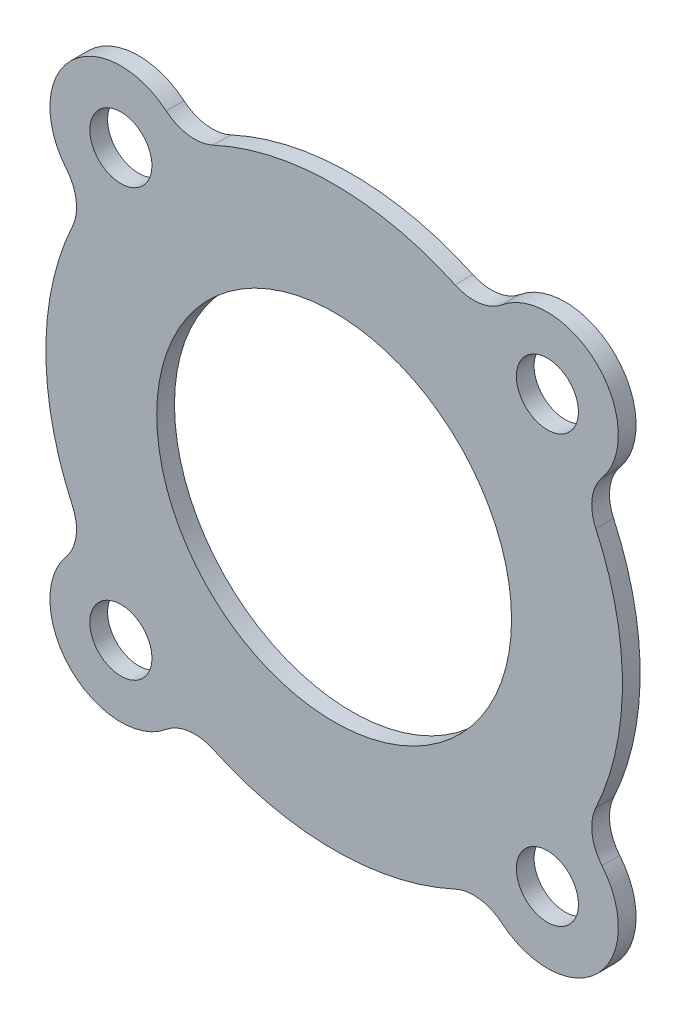
ISO-10303-21;
HEADER;
FILE_DESCRIPTION(('STEP AP214'),'2;1');
FILE_NAME('part.step','',(''),(''),'','','');
FILE_SCHEMA(('AUTOMOTIVE_DESIGN { 1 0 10303 214 1 1 1 1 }'));
ENDSEC;
DATA;
#1=APPLICATION_CONTEXT('core data for automotive mechanical design processes');
#2=APPLICATION_PROTOCOL_DEFINITION('international standard','automotive_design',2000,#1);
#3=PRODUCT_CONTEXT('',#1,'mechanical');
#4=PRODUCT('Part','Part','',(#3));
#5=PRODUCT_RELATED_PRODUCT_CATEGORY('part','',(#4));
#6=PRODUCT_DEFINITION_FORMATION('','',#4);
#7=PRODUCT_DEFINITION_CONTEXT('part definition',#1,'design');
#8=PRODUCT_DEFINITION('design','',#6,#7);
#9=PRODUCT_DEFINITION_SHAPE('','',#8);
#10=(LENGTH_UNIT() NAMED_UNIT(*) SI_UNIT(.MILLI.,.METRE.));
#11=(NAMED_UNIT(*) PLANE_ANGLE_UNIT() SI_UNIT($,.RADIAN.));
#12=(NAMED_UNIT(*) SI_UNIT($,.STERADIAN.) SOLID_ANGLE_UNIT());
#13=UNCERTAINTY_MEASURE_WITH_UNIT(LENGTH_MEASURE(1.E-05),#10,'distance_accuracy_value','');
#14=(GEOMETRIC_REPRESENTATION_CONTEXT(3) GLOBAL_UNCERTAINTY_ASSIGNED_CONTEXT((#13)) GLOBAL_UNIT_ASSIGNED_CONTEXT((#10,
#11,#12)) REPRESENTATION_CONTEXT('',''));
#15=CARTESIAN_POINT('',(0.,0.,0.));
#16=DIRECTION('',(0.,0.,1.));
#17=DIRECTION('',(1.,0.,0.));
#18=AXIS2_PLACEMENT_3D('',#15,#16,#17);
#19=CARTESIAN_POINT('',(0.,0.,2.));
#20=DIRECTION('',(0.,0.,-1.));
#21=DIRECTION('',(-1.,0.,0.));
#22=AXIS2_PLACEMENT_3D('',#19,#20,#21);
#23=CYLINDRICAL_SURFACE('',#22,32.5);
#24=CARTESIAN_POINT('',(0.,0.,0.));
#25=DIRECTION('',(0.,0.,1.));
#26=DIRECTION('',(1.,0.,0.));
#27=AXIS2_PLACEMENT_3D('',#24,#25,#26);
#28=CIRCLE('',#27,32.5);
#29=CARTESIAN_POINT('',(13.6353021774067,29.5013310637132,0.));
#30=VERTEX_POINT('',#29);
#31=CARTESIAN_POINT('',(-13.6353021774065,29.5013310637132,0.));
#32=VERTEX_POINT('',#31);
#33=EDGE_CURVE('E170',#30,#32,#28,.T.);
#34=ORIENTED_EDGE('',*,*,#33,.T.);
#35=DIRECTION('',(0.,0.,-1.));
#36=VECTOR('',#35,1.);
#37=CARTESIAN_POINT('',(-13.6353021774065,29.5013310637133,2.));
#38=LINE('',#37,#36);
#39=CARTESIAN_POINT('',(-13.6353021774065,29.5013310637132,2.));
#40=VERTEX_POINT('',#39);
#41=EDGE_CURVE('E292',#32,#40,#38,.F.);
#42=ORIENTED_EDGE('',*,*,#41,.T.);
#43=CARTESIAN_POINT('',(0.,0.,2.));
#44=DIRECTION('',(0.,0.,1.));
#45=DIRECTION('',(1.,0.,0.));
#46=AXIS2_PLACEMENT_3D('',#43,#44,#45);
#47=CIRCLE('',#46,32.5);
#48=CARTESIAN_POINT('',(13.6353021774067,29.5013310637132,2.));
#49=VERTEX_POINT('',#48);
#50=EDGE_CURVE('E173',#49,#40,#47,.T.);
#51=ORIENTED_EDGE('',*,*,#50,.F.);
#52=DIRECTION('',(0.,0.,-1.));
#53=VECTOR('',#52,1.);
#54=CARTESIAN_POINT('',(13.6353021774067,29.5013310637132,2.));
#55=LINE('',#54,#53);
#56=EDGE_CURVE('E156',#49,#30,#55,.T.);
#57=ORIENTED_EDGE('',*,*,#56,.T.);
#58=EDGE_LOOP('',(#34,#42,#51,#57));
#59=FACE_BOUND('',#58,.T.);
#60=ADVANCED_FACE('F39',(#59),#23,.T.);
#61=CARTESIAN_POINT('',(-29.501331063713,13.635302177407,2.));
#62=VERTEX_POINT('',#61);
#63=CARTESIAN_POINT('',(-29.5013310637131,-13.6353021774068,2.));
#64=VERTEX_POINT('',#63);
#65=EDGE_CURVE('E215',#62,#64,#47,.T.);
#66=ORIENTED_EDGE('',*,*,#65,.F.);
#67=DIRECTION('',(0.,0.,-1.));
#68=VECTOR('',#67,1.);
#69=CARTESIAN_POINT('',(-29.501331063713,13.635302177407,2.));
#70=LINE('',#69,#68);
#71=CARTESIAN_POINT('',(-29.501331063713,13.635302177407,0.));
#72=VERTEX_POINT('',#71);
#73=EDGE_CURVE('E301',#62,#72,#70,.T.);
#74=ORIENTED_EDGE('',*,*,#73,.T.);
#75=CARTESIAN_POINT('',(-29.5013310637131,-13.6353021774068,0.));
#76=VERTEX_POINT('',#75);
#77=EDGE_CURVE('E185',#72,#76,#28,.T.);
#78=ORIENTED_EDGE('',*,*,#77,.T.);
#79=DIRECTION('',(0.,0.,-1.));
#80=VECTOR('',#79,1.);
#81=CARTESIAN_POINT('',(-29.5013310637131,-13.6353021774068,2.));
#82=LINE('',#81,#80);
#83=EDGE_CURVE('E267',#76,#64,#82,.F.);
#84=ORIENTED_EDGE('',*,*,#83,.T.);
#85=EDGE_LOOP('',(#66,#74,#78,#84));
#86=FACE_BOUND('',#85,.T.);
#87=ADVANCED_FACE('F320',(#86),#23,.T.);
#88=CARTESIAN_POINT('',(-13.6353021774067,-29.5013310637132,2.));
#89=VERTEX_POINT('',#88);
#90=CARTESIAN_POINT('',(13.6353021774067,-29.5013310637132,2.));
#91=VERTEX_POINT('',#90);
#92=EDGE_CURVE('E190',#89,#91,#47,.T.);
#93=ORIENTED_EDGE('',*,*,#92,.F.);
#94=DIRECTION('',(0.,0.,-1.));
#95=VECTOR('',#94,1.);
#96=CARTESIAN_POINT('',(-13.6353021774067,-29.5013310637132,2.));
#97=LINE('',#96,#95);
#98=CARTESIAN_POINT('',(-13.6353021774067,-29.5013310637132,0.));
#99=VERTEX_POINT('',#98);
#100=EDGE_CURVE('E277',#89,#99,#97,.T.);
#101=ORIENTED_EDGE('',*,*,#100,.T.);
#102=CARTESIAN_POINT('',(13.6353021774067,-29.5013310637132,0.));
#103=VERTEX_POINT('',#102);
#104=EDGE_CURVE('E192',#99,#103,#28,.T.);
#105=ORIENTED_EDGE('',*,*,#104,.T.);
#106=DIRECTION('',(0.,0.,-1.));
#107=VECTOR('',#106,1.);
#108=CARTESIAN_POINT('',(13.6353021774067,-29.5013310637132,2.));
#109=LINE('',#108,#107);
#110=EDGE_CURVE('E238',#103,#91,#109,.F.);
#111=ORIENTED_EDGE('',*,*,#110,.T.);
#112=EDGE_LOOP('',(#93,#101,#105,#111));
#113=FACE_BOUND('',#112,.T.);
#114=ADVANCED_FACE('F244',(#113),#23,.T.);
#115=CARTESIAN_POINT('',(0.,0.,2.));
#116=DIRECTION('',(0.,0.,1.));
#117=DIRECTION('',(1.,0.,0.));
#118=AXIS2_PLACEMENT_3D('',#115,#116,#117);
#119=PLANE('',#118);
#120=CARTESIAN_POINT('',(24.0416305603426,-24.0416305603427,2.));
#121=DIRECTION('',(0.,0.,1.));
#122=DIRECTION('',(0.,-1.,0.));
#123=AXIS2_PLACEMENT_3D('',#120,#121,#122);
#124=CIRCLE('',#123,3.5);
#125=CARTESIAN_POINT('',(24.0416305603426,-27.5416305603427,2.));
#126=VERTEX_POINT('',#125);
#127=EDGE_CURVE('E457',#126,#126,#124,.T.);
#128=ORIENTED_EDGE('',*,*,#127,.F.);
#129=EDGE_LOOP('',(#128));
#130=FACE_BOUND('',#129,.T.);
#131=CARTESIAN_POINT('',(-24.0416305603426,-24.0416305603427,2.));
#132=DIRECTION('',(0.,0.,1.));
#133=DIRECTION('',(-1.,0.,0.));
#134=AXIS2_PLACEMENT_3D('',#131,#132,#133);
#135=CIRCLE('',#134,3.5);
#136=CARTESIAN_POINT('',(-27.5416305603426,-24.0416305603427,2.));
#137=VERTEX_POINT('',#136);
#138=EDGE_CURVE('E468',#137,#137,#135,.T.);
#139=ORIENTED_EDGE('',*,*,#138,.F.);
#140=EDGE_LOOP('',(#139));
#141=FACE_BOUND('',#140,.T.);
#142=CARTESIAN_POINT('',(-24.0416305603424,24.0416305603428,2.));
#143=DIRECTION('',(0.,0.,1.));
#144=DIRECTION('',(0.,1.,0.));
#145=AXIS2_PLACEMENT_3D('',#142,#143,#144);
#146=CIRCLE('',#145,3.5);
#147=CARTESIAN_POINT('',(-24.0416305603424,27.5416305603428,2.));
#148=VERTEX_POINT('',#147);
#149=EDGE_CURVE('E460',#148,#148,#146,.T.);
#150=ORIENTED_EDGE('',*,*,#149,.F.);
#151=EDGE_LOOP('',(#150));
#152=FACE_BOUND('',#151,.T.);
#153=ORIENTED_EDGE('',*,*,#50,.T.);
#154=CARTESIAN_POINT('',(-15.7330409739306,34.0399973812076,2.));
#155=DIRECTION('',(0.,0.,1.));
#156=DIRECTION('',(1.,0.,0.));
#157=AXIS2_PLACEMENT_3D('',#154,#155,#156);
#158=CIRCLE('',#157,5.);
#159=CARTESIAN_POINT('',(-18.9286523533198,30.194471680875,2.));
#160=VERTEX_POINT('',#159);
#161=EDGE_CURVE('E304',#40,#160,#158,.F.);
#162=ORIENTED_EDGE('',*,*,#161,.T.);
#163=CARTESIAN_POINT('',(-24.0416305603424,24.0416305603428,2.));
#164=DIRECTION('',(0.,0.,1.));
#165=DIRECTION('',(0.,1.,0.));
#166=AXIS2_PLACEMENT_3D('',#163,#164,#165);
#167=CIRCLE('',#166,7.99999999999999);
#168=CARTESIAN_POINT('',(-30.1944716808747,18.9286523533203,2.));
#169=VERTEX_POINT('',#168);
#170=EDGE_CURVE('E317',#160,#169,#167,.T.);
#171=ORIENTED_EDGE('',*,*,#170,.T.);
#172=CARTESIAN_POINT('',(-34.0399973812073,15.7330409739312,2.));
#173=DIRECTION('',(0.,0.,1.));
#174=DIRECTION('',(1.,0.,0.));
#175=AXIS2_PLACEMENT_3D('',#172,#173,#174);
#176=CIRCLE('',#175,5.);
#177=EDGE_CURVE('E11',#169,#62,#176,.F.);
#178=ORIENTED_EDGE('',*,*,#177,.T.);
#179=ORIENTED_EDGE('',*,*,#65,.T.);
#180=CARTESIAN_POINT('',(-34.0399973812074,-15.733040973931,2.));
#181=DIRECTION('',(0.,0.,1.));
#182=DIRECTION('',(1.,0.,0.));
#183=AXIS2_PLACEMENT_3D('',#180,#181,#182);
#184=CIRCLE('',#183,5.);
#185=CARTESIAN_POINT('',(-30.1944716808748,-18.9286523533201,2.));
#186=VERTEX_POINT('',#185);
#187=EDGE_CURVE('E280',#64,#186,#184,.F.);
#188=ORIENTED_EDGE('',*,*,#187,.T.);
#189=CARTESIAN_POINT('',(-24.0416305603426,-24.0416305603427,2.));
#190=DIRECTION('',(0.,0.,1.));
#191=DIRECTION('',(-1.,0.,0.));
#192=AXIS2_PLACEMENT_3D('',#189,#190,#191);
#193=CIRCLE('',#192,7.99999999999999);
#194=CARTESIAN_POINT('',(-18.92865235332,-30.1944716808749,2.));
#195=VERTEX_POINT('',#194);
#196=EDGE_CURVE('E316',#186,#195,#193,.T.);
#197=ORIENTED_EDGE('',*,*,#196,.T.);
#198=CARTESIAN_POINT('',(-15.7330409739308,-34.0399973812075,2.));
#199=DIRECTION('',(0.,0.,1.));
#200=DIRECTION('',(1.,0.,0.));
#201=AXIS2_PLACEMENT_3D('',#198,#199,#200);
#202=CIRCLE('',#201,5.);
#203=EDGE_CURVE('E228',#195,#89,#202,.F.);
#204=ORIENTED_EDGE('',*,*,#203,.T.);
#205=ORIENTED_EDGE('',*,*,#92,.T.);
#206=CARTESIAN_POINT('',(15.7330409739309,-34.0399973812075,2.));
#207=DIRECTION('',(0.,0.,1.));
#208=DIRECTION('',(1.,0.,0.));
#209=AXIS2_PLACEMENT_3D('',#206,#207,#208);
#210=CIRCLE('',#209,5.);
#211=CARTESIAN_POINT('',(18.92865235332,-30.1944716808749,2.));
#212=VERTEX_POINT('',#211);
#213=EDGE_CURVE('E224',#91,#212,#210,.F.);
#214=ORIENTED_EDGE('',*,*,#213,.T.);
#215=CARTESIAN_POINT('',(24.0416305603426,-24.0416305603427,2.));
#216=DIRECTION('',(0.,0.,1.));
#217=DIRECTION('',(0.,-1.,0.));
#218=AXIS2_PLACEMENT_3D('',#215,#216,#217);
#219=CIRCLE('',#218,7.99999999999999);
#220=CARTESIAN_POINT('',(30.1944716808748,-18.9286523533201,2.));
#221=VERTEX_POINT('',#220);
#222=EDGE_CURVE('E336',#212,#221,#219,.T.);
#223=ORIENTED_EDGE('',*,*,#222,.T.);
#224=CARTESIAN_POINT('',(34.0399973812074,-15.733040973931,2.));
#225=DIRECTION('',(0.,0.,1.));
#226=DIRECTION('',(1.,0.,0.));
#227=AXIS2_PLACEMENT_3D('',#224,#225,#226);
#228=CIRCLE('',#227,5.);
#229=CARTESIAN_POINT('',(29.5013310637131,-13.6353021774068,2.));
#230=VERTEX_POINT('',#229);
#231=EDGE_CURVE('E264',#221,#230,#228,.F.);
#232=ORIENTED_EDGE('',*,*,#231,.T.);
#233=CARTESIAN_POINT('',(29.5013310637131,13.6353021774068,2.));
#234=VERTEX_POINT('',#233);
#235=EDGE_CURVE('E184',#230,#234,#47,.T.);
#236=ORIENTED_EDGE('',*,*,#235,.T.);
#237=CARTESIAN_POINT('',(34.0399973812074,15.733040973931,2.));
#238=DIRECTION('',(0.,0.,1.));
#239=DIRECTION('',(1.,0.,0.));
#240=AXIS2_PLACEMENT_3D('',#237,#238,#239);
#241=CIRCLE('',#240,5.);
#242=CARTESIAN_POINT('',(30.1944716808748,18.9286523533201,2.));
#243=VERTEX_POINT('',#242);
#244=EDGE_CURVE('E359',#234,#243,#241,.F.);
#245=ORIENTED_EDGE('',*,*,#244,.T.);
#246=CARTESIAN_POINT('',(24.0416305603426,24.0416305603427,2.));
#247=DIRECTION('',(0.,0.,1.));
#248=DIRECTION('',(1.,0.,0.));
#249=AXIS2_PLACEMENT_3D('',#246,#247,#248);
#250=CIRCLE('',#249,7.99999999999999);
#251=CARTESIAN_POINT('',(18.92865235332,30.1944716808749,2.));
#252=VERTEX_POINT('',#251);
#253=EDGE_CURVE('E212',#243,#252,#250,.T.);
#254=ORIENTED_EDGE('',*,*,#253,.T.);
#255=CARTESIAN_POINT('',(15.7330409739308,34.0399973812075,2.));
#256=DIRECTION('',(0.,0.,1.));
#257=DIRECTION('',(1.,0.,0.));
#258=AXIS2_PLACEMENT_3D('',#255,#256,#257);
#259=CIRCLE('',#258,5.);
#260=EDGE_CURVE('E163',#252,#49,#259,.F.);
#261=ORIENTED_EDGE('',*,*,#260,.T.);
#262=EDGE_LOOP('',(#153,#162,#171,#178,#179,#188,#197,#204,#205,#214,#223,#232,#236,#245,#254,#261));
#263=FACE_BOUND('',#262,.T.);
#264=CARTESIAN_POINT('',(24.0416305603426,24.0416305603427,2.));
#265=DIRECTION('',(0.,0.,1.));
#266=DIRECTION('',(1.,0.,0.));
#267=AXIS2_PLACEMENT_3D('',#264,#265,#266);
#268=CIRCLE('',#267,3.5);
#269=CARTESIAN_POINT('',(27.5416305603426,24.0416305603427,2.));
#270=VERTEX_POINT('',#269);
#271=EDGE_CURVE('E344',#270,#270,#268,.T.);
#272=ORIENTED_EDGE('',*,*,#271,.F.);
#273=EDGE_LOOP('',(#272));
#274=FACE_BOUND('',#273,.T.);
#275=CARTESIAN_POINT('',(0.,0.,2.));
#276=DIRECTION('',(0.,0.,1.));
#277=DIRECTION('',(1.,0.,0.));
#278=AXIS2_PLACEMENT_3D('',#275,#276,#277);
#279=CIRCLE('',#278,20.);
#280=CARTESIAN_POINT('',(20.,0.,2.));
#281=VERTEX_POINT('',#280);
#282=EDGE_CURVE('E194',#281,#281,#279,.T.);
#283=ORIENTED_EDGE('',*,*,#282,.F.);
#284=EDGE_LOOP('',(#283));
#285=FACE_BOUND('',#284,.T.);
#286=ADVANCED_FACE('F221',(#130,#141,#152,#263,#274,#285),#119,.T.);
#287=CARTESIAN_POINT('',(0.,0.,0.));
#288=DIRECTION('',(0.,0.,1.));
#289=DIRECTION('',(1.,0.,0.));
#290=AXIS2_PLACEMENT_3D('',#287,#288,#289);
#291=PLANE('',#290);
#292=CARTESIAN_POINT('',(24.0416305603426,-24.0416305603427,0.));
#293=DIRECTION('',(0.,0.,1.));
#294=DIRECTION('',(0.,-1.,0.));
#295=AXIS2_PLACEMENT_3D('',#292,#293,#294);
#296=CIRCLE('',#295,3.5);
#297=CARTESIAN_POINT('',(24.0416305603426,-27.5416305603427,0.));
#298=VERTEX_POINT('',#297);
#299=EDGE_CURVE('E454',#298,#298,#296,.T.);
#300=ORIENTED_EDGE('',*,*,#299,.T.);
#301=EDGE_LOOP('',(#300));
#302=FACE_BOUND('',#301,.T.);
#303=CARTESIAN_POINT('',(-24.0416305603426,-24.0416305603427,0.));
#304=DIRECTION('',(0.,0.,1.));
#305=DIRECTION('',(-1.,0.,0.));
#306=AXIS2_PLACEMENT_3D('',#303,#304,#305);
#307=CIRCLE('',#306,3.5);
#308=CARTESIAN_POINT('',(-27.5416305603426,-24.0416305603427,0.));
#309=VERTEX_POINT('',#308);
#310=EDGE_CURVE('E472',#309,#309,#307,.T.);
#311=ORIENTED_EDGE('',*,*,#310,.T.);
#312=EDGE_LOOP('',(#311));
#313=FACE_BOUND('',#312,.T.);
#314=CARTESIAN_POINT('',(-24.0416305603424,24.0416305603428,0.));
#315=DIRECTION('',(0.,0.,1.));
#316=DIRECTION('',(0.,1.,0.));
#317=AXIS2_PLACEMENT_3D('',#314,#315,#316);
#318=CIRCLE('',#317,3.5);
#319=CARTESIAN_POINT('',(-24.0416305603424,27.5416305603428,0.));
#320=VERTEX_POINT('',#319);
#321=EDGE_CURVE('E464',#320,#320,#318,.T.);
#322=ORIENTED_EDGE('',*,*,#321,.T.);
#323=EDGE_LOOP('',(#322));
#324=FACE_BOUND('',#323,.T.);
#325=CARTESIAN_POINT('',(24.0416305603426,24.0416305603427,0.));
#326=DIRECTION('',(0.,0.,1.));
#327=DIRECTION('',(1.,0.,0.));
#328=AXIS2_PLACEMENT_3D('',#325,#326,#327);
#329=CIRCLE('',#328,3.5);
#330=CARTESIAN_POINT('',(27.5416305603426,24.0416305603427,0.));
#331=VERTEX_POINT('',#330);
#332=EDGE_CURVE('E347',#331,#331,#329,.T.);
#333=ORIENTED_EDGE('',*,*,#332,.T.);
#334=EDGE_LOOP('',(#333));
#335=FACE_BOUND('',#334,.T.);
#336=ORIENTED_EDGE('',*,*,#77,.F.);
#337=CARTESIAN_POINT('',(-34.0399973812073,15.7330409739312,0.));
#338=DIRECTION('',(0.,0.,1.));
#339=DIRECTION('',(1.,0.,0.));
#340=AXIS2_PLACEMENT_3D('',#337,#338,#339);
#341=CIRCLE('',#340,5.);
#342=CARTESIAN_POINT('',(-30.1944716808747,18.9286523533203,0.));
#343=VERTEX_POINT('',#342);
#344=EDGE_CURVE('E48',#72,#343,#341,.T.);
#345=ORIENTED_EDGE('',*,*,#344,.T.);
#346=CARTESIAN_POINT('',(-24.0416305603424,24.0416305603428,0.));
#347=DIRECTION('',(0.,0.,1.));
#348=DIRECTION('',(0.,1.,0.));
#349=AXIS2_PLACEMENT_3D('',#346,#347,#348);
#350=CIRCLE('',#349,7.99999999999999);
#351=CARTESIAN_POINT('',(-18.9286523533198,30.194471680875,0.));
#352=VERTEX_POINT('',#351);
#353=EDGE_CURVE('E310',#352,#343,#350,.T.);
#354=ORIENTED_EDGE('',*,*,#353,.F.);
#355=CARTESIAN_POINT('',(-15.7330409739306,34.0399973812076,0.));
#356=DIRECTION('',(0.,0.,1.));
#357=DIRECTION('',(1.,0.,0.));
#358=AXIS2_PLACEMENT_3D('',#355,#356,#357);
#359=CIRCLE('',#358,5.);
#360=EDGE_CURVE('E182',#352,#32,#359,.T.);
#361=ORIENTED_EDGE('',*,*,#360,.T.);
#362=ORIENTED_EDGE('',*,*,#33,.F.);
#363=CARTESIAN_POINT('',(15.7330409739308,34.0399973812075,0.));
#364=DIRECTION('',(0.,0.,1.));
#365=DIRECTION('',(1.,0.,0.));
#366=AXIS2_PLACEMENT_3D('',#363,#364,#365);
#367=CIRCLE('',#366,5.);
#368=CARTESIAN_POINT('',(18.92865235332,30.1944716808749,0.));
#369=VERTEX_POINT('',#368);
#370=EDGE_CURVE('E152',#30,#369,#367,.T.);
#371=ORIENTED_EDGE('',*,*,#370,.T.);
#372=CARTESIAN_POINT('',(24.0416305603426,24.0416305603427,0.));
#373=DIRECTION('',(0.,0.,1.));
#374=DIRECTION('',(1.,0.,0.));
#375=AXIS2_PLACEMENT_3D('',#372,#373,#374);
#376=CIRCLE('',#375,7.99999999999999);
#377=CARTESIAN_POINT('',(30.1944716808748,18.9286523533201,0.));
#378=VERTEX_POINT('',#377);
#379=EDGE_CURVE('E209',#378,#369,#376,.T.);
#380=ORIENTED_EDGE('',*,*,#379,.F.);
#381=CARTESIAN_POINT('',(34.0399973812074,15.733040973931,0.));
#382=DIRECTION('',(0.,0.,1.));
#383=DIRECTION('',(1.,0.,0.));
#384=AXIS2_PLACEMENT_3D('',#381,#382,#383);
#385=CIRCLE('',#384,5.);
#386=CARTESIAN_POINT('',(29.5013310637131,13.6353021774068,0.));
#387=VERTEX_POINT('',#386);
#388=EDGE_CURVE('E164',#378,#387,#385,.T.);
#389=ORIENTED_EDGE('',*,*,#388,.T.);
#390=CARTESIAN_POINT('',(29.5013310637131,-13.6353021774068,0.));
#391=VERTEX_POINT('',#390);
#392=EDGE_CURVE('E187',#391,#387,#28,.T.);
#393=ORIENTED_EDGE('',*,*,#392,.F.);
#394=CARTESIAN_POINT('',(34.0399973812074,-15.733040973931,0.));
#395=DIRECTION('',(0.,0.,1.));
#396=DIRECTION('',(1.,0.,0.));
#397=AXIS2_PLACEMENT_3D('',#394,#395,#396);
#398=CIRCLE('',#397,5.);
#399=CARTESIAN_POINT('',(30.1944716808748,-18.9286523533201,0.));
#400=VERTEX_POINT('',#399);
#401=EDGE_CURVE('E261',#391,#400,#398,.T.);
#402=ORIENTED_EDGE('',*,*,#401,.T.);
#403=CARTESIAN_POINT('',(24.0416305603426,-24.0416305603427,0.));
#404=DIRECTION('',(0.,0.,1.));
#405=DIRECTION('',(0.,-1.,0.));
#406=AXIS2_PLACEMENT_3D('',#403,#404,#405);
#407=CIRCLE('',#406,7.99999999999999);
#408=CARTESIAN_POINT('',(18.92865235332,-30.1944716808749,0.));
#409=VERTEX_POINT('',#408);
#410=EDGE_CURVE('E340',#409,#400,#407,.T.);
#411=ORIENTED_EDGE('',*,*,#410,.F.);
#412=CARTESIAN_POINT('',(15.7330409739309,-34.0399973812075,0.));
#413=DIRECTION('',(0.,0.,1.));
#414=DIRECTION('',(1.,0.,0.));
#415=AXIS2_PLACEMENT_3D('',#412,#413,#414);
#416=CIRCLE('',#415,5.);
#417=EDGE_CURVE('E241',#409,#103,#416,.T.);
#418=ORIENTED_EDGE('',*,*,#417,.T.);
#419=ORIENTED_EDGE('',*,*,#104,.F.);
#420=CARTESIAN_POINT('',(-15.7330409739308,-34.0399973812075,0.));
#421=DIRECTION('',(0.,0.,1.));
#422=DIRECTION('',(1.,0.,0.));
#423=AXIS2_PLACEMENT_3D('',#420,#421,#422);
#424=CIRCLE('',#423,5.);
#425=CARTESIAN_POINT('',(-18.92865235332,-30.1944716808749,0.));
#426=VERTEX_POINT('',#425);
#427=EDGE_CURVE('E287',#99,#426,#424,.T.);
#428=ORIENTED_EDGE('',*,*,#427,.T.);
#429=CARTESIAN_POINT('',(-24.0416305603426,-24.0416305603427,0.));
#430=DIRECTION('',(0.,0.,1.));
#431=DIRECTION('',(-1.,0.,0.));
#432=AXIS2_PLACEMENT_3D('',#429,#430,#431);
#433=CIRCLE('',#432,7.99999999999999);
#434=CARTESIAN_POINT('',(-30.1944716808748,-18.9286523533201,0.));
#435=VERTEX_POINT('',#434);
#436=EDGE_CURVE('E333',#435,#426,#433,.T.);
#437=ORIENTED_EDGE('',*,*,#436,.F.);
#438=CARTESIAN_POINT('',(-34.0399973812074,-15.733040973931,0.));
#439=DIRECTION('',(0.,0.,1.));
#440=DIRECTION('',(1.,0.,0.));
#441=AXIS2_PLACEMENT_3D('',#438,#439,#440);
#442=CIRCLE('',#441,5.);
#443=EDGE_CURVE('E283',#435,#76,#442,.T.);
#444=ORIENTED_EDGE('',*,*,#443,.T.);
#445=EDGE_LOOP('',(#336,#345,#354,#361,#362,#371,#380,#389,#393,#402,#411,#418,#419,#428,#437,#444));
#446=FACE_BOUND('',#445,.T.);
#447=CARTESIAN_POINT('',(0.,0.,0.));
#448=DIRECTION('',(0.,0.,1.));
#449=DIRECTION('',(1.,0.,0.));
#450=AXIS2_PLACEMENT_3D('',#447,#448,#449);
#451=CIRCLE('',#450,20.);
#452=CARTESIAN_POINT('',(20.,0.,0.));
#453=VERTEX_POINT('',#452);
#454=EDGE_CURVE('E203',#453,#453,#451,.T.);
#455=ORIENTED_EDGE('',*,*,#454,.T.);
#456=EDGE_LOOP('',(#455));
#457=FACE_BOUND('',#456,.T.);
#458=ADVANCED_FACE('F178',(#302,#313,#324,#335,#446,#457),#291,.F.);
#459=ORIENTED_EDGE('',*,*,#235,.F.);
#460=DIRECTION('',(0.,0.,-1.));
#461=VECTOR('',#460,1.);
#462=CARTESIAN_POINT('',(29.5013310637131,-13.6353021774068,2.));
#463=LINE('',#462,#461);
#464=EDGE_CURVE('E242',#230,#391,#463,.T.);
#465=ORIENTED_EDGE('',*,*,#464,.T.);
#466=ORIENTED_EDGE('',*,*,#392,.T.);
#467=DIRECTION('',(0.,0.,-1.));
#468=VECTOR('',#467,1.);
#469=CARTESIAN_POINT('',(29.5013310637131,13.6353021774068,2.));
#470=LINE('',#469,#468);
#471=EDGE_CURVE('E175',#387,#234,#470,.F.);
#472=ORIENTED_EDGE('',*,*,#471,.T.);
#473=EDGE_LOOP('',(#459,#465,#466,#472));
#474=FACE_BOUND('',#473,.T.);
#475=ADVANCED_FACE('F378',(#474),#23,.T.);
#476=CARTESIAN_POINT('',(0.,0.,2.));
#477=DIRECTION('',(0.,0.,-1.));
#478=DIRECTION('',(-1.,0.,0.));
#479=AXIS2_PLACEMENT_3D('',#476,#477,#478);
#480=CYLINDRICAL_SURFACE('',#479,20.);
#481=ORIENTED_EDGE('',*,*,#282,.T.);
#482=EDGE_LOOP('',(#481));
#483=FACE_BOUND('',#482,.T.);
#484=ORIENTED_EDGE('',*,*,#454,.F.);
#485=EDGE_LOOP('',(#484));
#486=FACE_BOUND('',#485,.T.);
#487=ADVANCED_FACE('F404',(#483,#486),#480,.F.);
#488=CARTESIAN_POINT('',(24.0416305603426,24.0416305603427,0.));
#489=DIRECTION('',(0.,0.,1.));
#490=DIRECTION('',(1.,0.,0.));
#491=AXIS2_PLACEMENT_3D('',#488,#489,#490);
#492=CYLINDRICAL_SURFACE('',#491,7.99999999999999);
#493=ORIENTED_EDGE('',*,*,#253,.F.);
#494=DIRECTION('',(0.,0.,1.));
#495=VECTOR('',#494,1.);
#496=CARTESIAN_POINT('',(30.1944716808748,18.9286523533201,0.));
#497=LINE('',#496,#495);
#498=EDGE_CURVE('E362',#243,#378,#497,.F.);
#499=ORIENTED_EDGE('',*,*,#498,.T.);
#500=ORIENTED_EDGE('',*,*,#379,.T.);
#501=DIRECTION('',(0.,0.,1.));
#502=VECTOR('',#501,1.);
#503=CARTESIAN_POINT('',(18.92865235332,30.1944716808749,0.));
#504=LINE('',#503,#502);
#505=EDGE_CURVE('E157',#369,#252,#504,.T.);
#506=ORIENTED_EDGE('',*,*,#505,.T.);
#507=EDGE_LOOP('',(#493,#499,#500,#506));
#508=FACE_BOUND('',#507,.T.);
#509=ADVANCED_FACE('F361',(#508),#492,.T.);
#510=CARTESIAN_POINT('',(24.0416305603426,24.0416305603427,0.));
#511=DIRECTION('',(0.,0.,1.));
#512=DIRECTION('',(1.,0.,0.));
#513=AXIS2_PLACEMENT_3D('',#510,#511,#512);
#514=CYLINDRICAL_SURFACE('',#513,3.5);
#515=ORIENTED_EDGE('',*,*,#332,.F.);
#516=EDGE_LOOP('',(#515));
#517=FACE_BOUND('',#516,.T.);
#518=ORIENTED_EDGE('',*,*,#271,.T.);
#519=EDGE_LOOP('',(#518));
#520=FACE_BOUND('',#519,.T.);
#521=ADVANCED_FACE('F423',(#517,#520),#514,.F.);
#522=CARTESIAN_POINT('',(34.0399973812074,15.733040973931,0.));
#523=DIRECTION('',(0.,0.,-1.));
#524=DIRECTION('',(-1.,0.,0.));
#525=AXIS2_PLACEMENT_3D('',#522,#523,#524);
#526=CYLINDRICAL_SURFACE('',#525,5.);
#527=ORIENTED_EDGE('',*,*,#388,.F.);
#528=ORIENTED_EDGE('',*,*,#498,.F.);
#529=ORIENTED_EDGE('',*,*,#244,.F.);
#530=ORIENTED_EDGE('',*,*,#471,.F.);
#531=EDGE_LOOP('',(#527,#528,#529,#530));
#532=FACE_BOUND('',#531,.T.);
#533=ADVANCED_FACE('F365',(#532),#526,.F.);
#534=CARTESIAN_POINT('',(15.7330409739308,34.0399973812075,0.));
#535=DIRECTION('',(0.,0.,1.));
#536=DIRECTION('',(1.,0.,0.));
#537=AXIS2_PLACEMENT_3D('',#534,#535,#536);
#538=CYLINDRICAL_SURFACE('',#537,5.);
#539=ORIENTED_EDGE('',*,*,#260,.F.);
#540=ORIENTED_EDGE('',*,*,#505,.F.);
#541=ORIENTED_EDGE('',*,*,#370,.F.);
#542=ORIENTED_EDGE('',*,*,#56,.F.);
#543=EDGE_LOOP('',(#539,#540,#541,#542));
#544=FACE_BOUND('',#543,.T.);
#545=ADVANCED_FACE('F155',(#544),#538,.F.);
#546=CARTESIAN_POINT('',(24.0416305603426,-24.0416305603427,0.));
#547=DIRECTION('',(0.,0.,1.));
#548=DIRECTION('',(1.,0.,0.));
#549=AXIS2_PLACEMENT_3D('',#546,#547,#548);
#550=CYLINDRICAL_SURFACE('',#549,7.99999999999999);
#551=ORIENTED_EDGE('',*,*,#222,.F.);
#552=DIRECTION('',(0.,0.,1.));
#553=VECTOR('',#552,1.);
#554=CARTESIAN_POINT('',(18.92865235332,-30.1944716808749,0.));
#555=LINE('',#554,#553);
#556=EDGE_CURVE('E239',#212,#409,#555,.F.);
#557=ORIENTED_EDGE('',*,*,#556,.T.);
#558=ORIENTED_EDGE('',*,*,#410,.T.);
#559=DIRECTION('',(0.,0.,1.));
#560=VECTOR('',#559,1.);
#561=CARTESIAN_POINT('',(30.1944716808748,-18.9286523533201,0.));
#562=LINE('',#561,#560);
#563=EDGE_CURVE('E248',#400,#221,#562,.T.);
#564=ORIENTED_EDGE('',*,*,#563,.T.);
#565=EDGE_LOOP('',(#551,#557,#558,#564));
#566=FACE_BOUND('',#565,.T.);
#567=ADVANCED_FACE('F386',(#566),#550,.T.);
#568=CARTESIAN_POINT('',(-24.0416305603426,-24.0416305603427,0.));
#569=DIRECTION('',(0.,0.,1.));
#570=DIRECTION('',(1.,0.,0.));
#571=AXIS2_PLACEMENT_3D('',#568,#569,#570);
#572=CYLINDRICAL_SURFACE('',#571,7.99999999999999);
#573=ORIENTED_EDGE('',*,*,#196,.F.);
#574=DIRECTION('',(0.,0.,1.));
#575=VECTOR('',#574,1.);
#576=CARTESIAN_POINT('',(-30.1944716808748,-18.9286523533201,0.));
#577=LINE('',#576,#575);
#578=EDGE_CURVE('E274',#186,#435,#577,.F.);
#579=ORIENTED_EDGE('',*,*,#578,.T.);
#580=ORIENTED_EDGE('',*,*,#436,.T.);
#581=DIRECTION('',(0.,0.,1.));
#582=VECTOR('',#581,1.);
#583=CARTESIAN_POINT('',(-18.92865235332,-30.1944716808749,0.));
#584=LINE('',#583,#582);
#585=EDGE_CURVE('E271',#426,#195,#584,.T.);
#586=ORIENTED_EDGE('',*,*,#585,.T.);
#587=EDGE_LOOP('',(#573,#579,#580,#586));
#588=FACE_BOUND('',#587,.T.);
#589=ADVANCED_FACE('F328',(#588),#572,.T.);
#590=CARTESIAN_POINT('',(-24.0416305603424,24.0416305603428,0.));
#591=DIRECTION('',(0.,0.,1.));
#592=DIRECTION('',(1.,0.,0.));
#593=AXIS2_PLACEMENT_3D('',#590,#591,#592);
#594=CYLINDRICAL_SURFACE('',#593,7.99999999999999);
#595=ORIENTED_EDGE('',*,*,#170,.F.);
#596=DIRECTION('',(0.,0.,1.));
#597=VECTOR('',#596,1.);
#598=CARTESIAN_POINT('',(-18.9286523533198,30.194471680875,0.));
#599=LINE('',#598,#597);
#600=EDGE_CURVE('E298',#160,#352,#599,.F.);
#601=ORIENTED_EDGE('',*,*,#600,.T.);
#602=ORIENTED_EDGE('',*,*,#353,.T.);
#603=DIRECTION('',(0.,0.,1.));
#604=VECTOR('',#603,1.);
#605=CARTESIAN_POINT('',(-30.1944716808747,18.9286523533203,0.));
#606=LINE('',#605,#604);
#607=EDGE_CURVE('E295',#343,#169,#606,.T.);
#608=ORIENTED_EDGE('',*,*,#607,.T.);
#609=EDGE_LOOP('',(#595,#601,#602,#608));
#610=FACE_BOUND('',#609,.T.);
#611=ADVANCED_FACE('F313',(#610),#594,.T.);
#612=CARTESIAN_POINT('',(-24.0416305603424,24.0416305603428,0.));
#613=DIRECTION('',(0.,0.,1.));
#614=DIRECTION('',(1.,0.,0.));
#615=AXIS2_PLACEMENT_3D('',#612,#613,#614);
#616=CYLINDRICAL_SURFACE('',#615,3.5);
#617=ORIENTED_EDGE('',*,*,#321,.F.);
#618=EDGE_LOOP('',(#617));
#619=FACE_BOUND('',#618,.T.);
#620=ORIENTED_EDGE('',*,*,#149,.T.);
#621=EDGE_LOOP('',(#620));
#622=FACE_BOUND('',#621,.T.);
#623=ADVANCED_FACE('F486',(#619,#622),#616,.F.);
#624=CARTESIAN_POINT('',(-24.0416305603426,-24.0416305603427,0.));
#625=DIRECTION('',(0.,0.,1.));
#626=DIRECTION('',(1.,0.,0.));
#627=AXIS2_PLACEMENT_3D('',#624,#625,#626);
#628=CYLINDRICAL_SURFACE('',#627,3.5);
#629=ORIENTED_EDGE('',*,*,#310,.F.);
#630=EDGE_LOOP('',(#629));
#631=FACE_BOUND('',#630,.T.);
#632=ORIENTED_EDGE('',*,*,#138,.T.);
#633=EDGE_LOOP('',(#632));
#634=FACE_BOUND('',#633,.T.);
#635=ADVANCED_FACE('F480',(#631,#634),#628,.F.);
#636=CARTESIAN_POINT('',(24.0416305603426,-24.0416305603427,0.));
#637=DIRECTION('',(0.,0.,1.));
#638=DIRECTION('',(1.,0.,0.));
#639=AXIS2_PLACEMENT_3D('',#636,#637,#638);
#640=CYLINDRICAL_SURFACE('',#639,3.5);
#641=ORIENTED_EDGE('',*,*,#299,.F.);
#642=EDGE_LOOP('',(#641));
#643=FACE_BOUND('',#642,.T.);
#644=ORIENTED_EDGE('',*,*,#127,.T.);
#645=EDGE_LOOP('',(#644));
#646=FACE_BOUND('',#645,.T.);
#647=ADVANCED_FACE('F439',(#643,#646),#640,.F.);
#648=CARTESIAN_POINT('',(15.7330409739309,-34.0399973812075,0.));
#649=DIRECTION('',(0.,0.,-1.));
#650=DIRECTION('',(-1.,0.,0.));
#651=AXIS2_PLACEMENT_3D('',#648,#649,#650);
#652=CYLINDRICAL_SURFACE('',#651,5.);
#653=ORIENTED_EDGE('',*,*,#417,.F.);
#654=ORIENTED_EDGE('',*,*,#556,.F.);
#655=ORIENTED_EDGE('',*,*,#213,.F.);
#656=ORIENTED_EDGE('',*,*,#110,.F.);
#657=EDGE_LOOP('',(#653,#654,#655,#656));
#658=FACE_BOUND('',#657,.T.);
#659=ADVANCED_FACE('F237',(#658),#652,.F.);
#660=CARTESIAN_POINT('',(34.0399973812074,-15.733040973931,0.));
#661=DIRECTION('',(0.,0.,1.));
#662=DIRECTION('',(1.,0.,0.));
#663=AXIS2_PLACEMENT_3D('',#660,#661,#662);
#664=CYLINDRICAL_SURFACE('',#663,5.);
#665=ORIENTED_EDGE('',*,*,#231,.F.);
#666=ORIENTED_EDGE('',*,*,#563,.F.);
#667=ORIENTED_EDGE('',*,*,#401,.F.);
#668=ORIENTED_EDGE('',*,*,#464,.F.);
#669=EDGE_LOOP('',(#665,#666,#667,#668));
#670=FACE_BOUND('',#669,.T.);
#671=ADVANCED_FACE('F382',(#670),#664,.F.);
#672=CARTESIAN_POINT('',(-34.0399973812074,-15.733040973931,0.));
#673=DIRECTION('',(0.,0.,-1.));
#674=DIRECTION('',(-1.,0.,0.));
#675=AXIS2_PLACEMENT_3D('',#672,#673,#674);
#676=CYLINDRICAL_SURFACE('',#675,5.);
#677=ORIENTED_EDGE('',*,*,#443,.F.);
#678=ORIENTED_EDGE('',*,*,#578,.F.);
#679=ORIENTED_EDGE('',*,*,#187,.F.);
#680=ORIENTED_EDGE('',*,*,#83,.F.);
#681=EDGE_LOOP('',(#677,#678,#679,#680));
#682=FACE_BOUND('',#681,.T.);
#683=ADVANCED_FACE('F324',(#682),#676,.F.);
#684=CARTESIAN_POINT('',(-15.7330409739308,-34.0399973812075,0.));
#685=DIRECTION('',(0.,0.,1.));
#686=DIRECTION('',(1.,0.,0.));
#687=AXIS2_PLACEMENT_3D('',#684,#685,#686);
#688=CYLINDRICAL_SURFACE('',#687,5.);
#689=ORIENTED_EDGE('',*,*,#203,.F.);
#690=ORIENTED_EDGE('',*,*,#585,.F.);
#691=ORIENTED_EDGE('',*,*,#427,.F.);
#692=ORIENTED_EDGE('',*,*,#100,.F.);
#693=EDGE_LOOP('',(#689,#690,#691,#692));
#694=FACE_BOUND('',#693,.T.);
#695=ADVANCED_FACE('F444',(#694),#688,.F.);
#696=CARTESIAN_POINT('',(-15.7330409739306,34.0399973812076,0.));
#697=DIRECTION('',(0.,0.,-1.));
#698=DIRECTION('',(-1.,0.,0.));
#699=AXIS2_PLACEMENT_3D('',#696,#697,#698);
#700=CYLINDRICAL_SURFACE('',#699,5.);
#701=ORIENTED_EDGE('',*,*,#360,.F.);
#702=ORIENTED_EDGE('',*,*,#600,.F.);
#703=ORIENTED_EDGE('',*,*,#161,.F.);
#704=ORIENTED_EDGE('',*,*,#41,.F.);
#705=EDGE_LOOP('',(#701,#702,#703,#704));
#706=FACE_BOUND('',#705,.T.);
#707=ADVANCED_FACE('F446',(#706),#700,.F.);
#708=CARTESIAN_POINT('',(-34.0399973812073,15.7330409739312,0.));
#709=DIRECTION('',(0.,0.,1.));
#710=DIRECTION('',(1.,0.,0.));
#711=AXIS2_PLACEMENT_3D('',#708,#709,#710);
#712=CYLINDRICAL_SURFACE('',#711,5.);
#713=ORIENTED_EDGE('',*,*,#177,.F.);
#714=ORIENTED_EDGE('',*,*,#607,.F.);
#715=ORIENTED_EDGE('',*,*,#344,.F.);
#716=ORIENTED_EDGE('',*,*,#73,.F.);
#717=EDGE_LOOP('',(#713,#714,#715,#716));
#718=FACE_BOUND('',#717,.T.);
#719=ADVANCED_FACE('F41',(#718),#712,.F.);
#720=CLOSED_SHELL('',(#60,#87,#114,#286,#458,#475,#487,#509,#521,#533,#545,#567,#589,#611,#623,
#635,#647,#659,#671,#683,#695,#707,#719));
#721=MANIFOLD_SOLID_BREP('B2',#720);
#722=ADVANCED_BREP_SHAPE_REPRESENTATION('',(#18,#721),#14);
#723=SHAPE_DEFINITION_REPRESENTATION(#9,#722);
ENDSEC;
END-ISO-10303-21;
